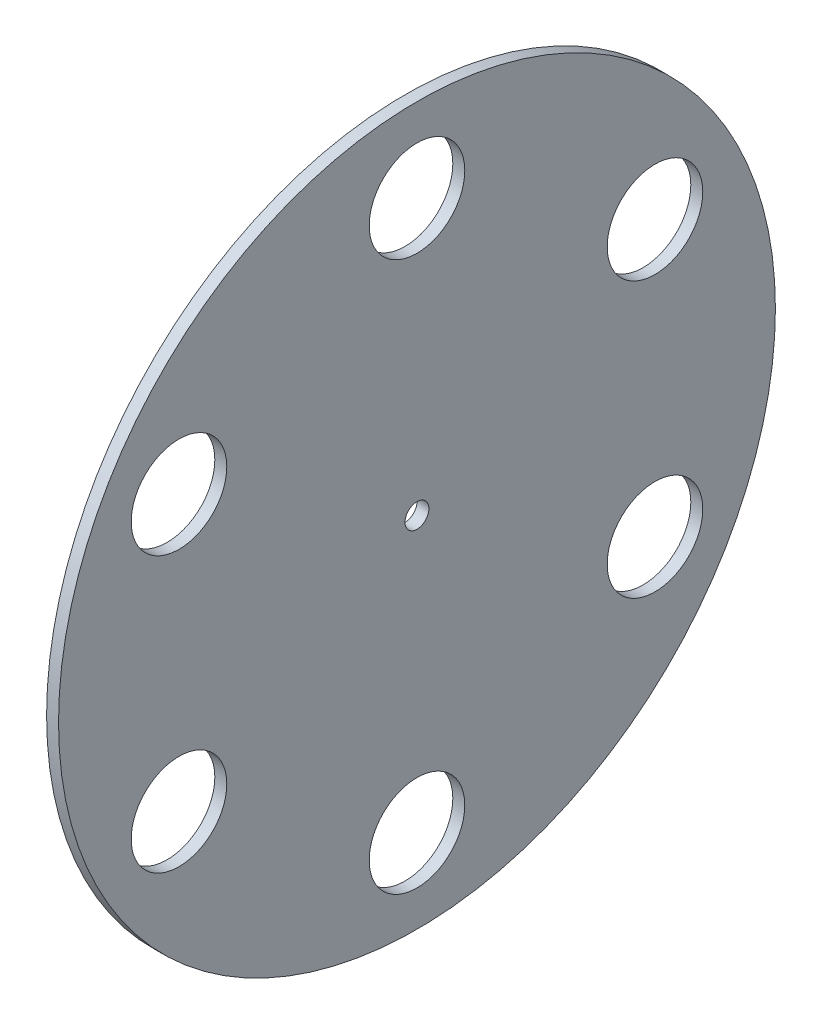
ISO-10303-21;
HEADER;
FILE_DESCRIPTION(('STEP AP214'),'2;1');
FILE_NAME('part.step','',(''),(''),'','','');
FILE_SCHEMA(('AUTOMOTIVE_DESIGN { 1 0 10303 214 1 1 1 1 }'));
ENDSEC;
DATA;
#1=APPLICATION_CONTEXT('core data for automotive mechanical design processes');
#2=APPLICATION_PROTOCOL_DEFINITION('international standard','automotive_design',2000,#1);
#3=PRODUCT_CONTEXT('',#1,'mechanical');
#4=PRODUCT('Part','Part','',(#3));
#5=PRODUCT_RELATED_PRODUCT_CATEGORY('part','',(#4));
#6=PRODUCT_DEFINITION_FORMATION('','',#4);
#7=PRODUCT_DEFINITION_CONTEXT('part definition',#1,'design');
#8=PRODUCT_DEFINITION('design','',#6,#7);
#9=PRODUCT_DEFINITION_SHAPE('','',#8);
#10=(LENGTH_UNIT() NAMED_UNIT(*) SI_UNIT(.MILLI.,.METRE.));
#11=(NAMED_UNIT(*) PLANE_ANGLE_UNIT() SI_UNIT($,.RADIAN.));
#12=(NAMED_UNIT(*) SI_UNIT($,.STERADIAN.) SOLID_ANGLE_UNIT());
#13=UNCERTAINTY_MEASURE_WITH_UNIT(LENGTH_MEASURE(1.E-05),#10,'distance_accuracy_value','');
#14=(GEOMETRIC_REPRESENTATION_CONTEXT(3) GLOBAL_UNCERTAINTY_ASSIGNED_CONTEXT((#13)) GLOBAL_UNIT_ASSIGNED_CONTEXT((#10,
#11,#12)) REPRESENTATION_CONTEXT('',''));
#15=CARTESIAN_POINT('',(0.,0.,0.));
#16=DIRECTION('',(0.,0.,1.));
#17=DIRECTION('',(1.,0.,0.));
#18=AXIS2_PLACEMENT_3D('',#15,#16,#17);
#19=CARTESIAN_POINT('',(10.,0.,0.));
#20=DIRECTION('',(1.,0.,0.));
#21=DIRECTION('',(0.,0.,-1.));
#22=AXIS2_PLACEMENT_3D('',#19,#20,#21);
#23=PLANE('',#22);
#24=CARTESIAN_POINT('',(10.,-115.000000000009,199.185842870406));
#25=DIRECTION('',(1.,0.,0.));
#26=DIRECTION('',(0.,0.,-1.));
#27=AXIS2_PLACEMENT_3D('',#24,#25,#26);
#28=CIRCLE('',#27,40.);
#29=CARTESIAN_POINT('',(10.,-115.000000000009,159.185842870406));
#30=VERTEX_POINT('',#29);
#31=EDGE_CURVE('E70',#30,#30,#28,.T.);
#32=ORIENTED_EDGE('',*,*,#31,.F.);
#33=EDGE_LOOP('',(#32));
#34=FACE_BOUND('',#33,.T.);
#35=CARTESIAN_POINT('',(10.,-114.999999999991,-199.185842870436));
#36=DIRECTION('',(1.,0.,0.));
#37=DIRECTION('',(0.,0.,-1.));
#38=AXIS2_PLACEMENT_3D('',#35,#36,#37);
#39=CIRCLE('',#38,40.);
#40=CARTESIAN_POINT('',(10.,-114.999999999991,-239.185842870436));
#41=VERTEX_POINT('',#40);
#42=EDGE_CURVE('E58',#41,#41,#39,.T.);
#43=ORIENTED_EDGE('',*,*,#42,.F.);
#44=EDGE_LOOP('',(#43));
#45=FACE_BOUND('',#44,.T.);
#46=CARTESIAN_POINT('',(10.,230.,0.));
#47=DIRECTION('',(1.,0.,0.));
#48=DIRECTION('',(0.,0.,-1.));
#49=AXIS2_PLACEMENT_3D('',#46,#47,#48);
#50=CIRCLE('',#49,40.);
#51=CARTESIAN_POINT('',(10.,230.,-40.));
#52=VERTEX_POINT('',#51);
#53=EDGE_CURVE('E46',#52,#52,#50,.T.);
#54=ORIENTED_EDGE('',*,*,#53,.F.);
#55=EDGE_LOOP('',(#54));
#56=FACE_BOUND('',#55,.T.);
#57=CARTESIAN_POINT('',(10.,0.,0.));
#58=DIRECTION('',(1.,0.,0.));
#59=DIRECTION('',(0.,0.,-1.));
#60=AXIS2_PLACEMENT_3D('',#57,#58,#59);
#61=CIRCLE('',#60,300.);
#62=CARTESIAN_POINT('',(10.,0.,-300.));
#63=VERTEX_POINT('',#62);
#64=EDGE_CURVE('E10',#63,#63,#61,.T.);
#65=ORIENTED_EDGE('',*,*,#64,.T.);
#66=EDGE_LOOP('',(#65));
#67=FACE_BOUND('',#66,.T.);
#68=CARTESIAN_POINT('',(10.,0.,0.));
#69=DIRECTION('',(1.,0.,0.));
#70=DIRECTION('',(0.,0.,-1.));
#71=AXIS2_PLACEMENT_3D('',#68,#69,#70);
#72=CIRCLE('',#71,10.);
#73=CARTESIAN_POINT('',(10.,0.,-10.));
#74=VERTEX_POINT('',#73);
#75=EDGE_CURVE('E41',#74,#74,#72,.T.);
#76=ORIENTED_EDGE('',*,*,#75,.F.);
#77=EDGE_LOOP('',(#76));
#78=FACE_BOUND('',#77,.T.);
#79=CARTESIAN_POINT('',(10.,115.000000000009,-199.185842870426));
#80=DIRECTION('',(1.,0.,0.));
#81=DIRECTION('',(0.,0.,-1.));
#82=AXIS2_PLACEMENT_3D('',#79,#80,#81);
#83=CIRCLE('',#82,40.);
#84=CARTESIAN_POINT('',(10.,115.000000000009,-239.185842870426));
#85=VERTEX_POINT('',#84);
#86=EDGE_CURVE('E52',#85,#85,#83,.T.);
#87=ORIENTED_EDGE('',*,*,#86,.F.);
#88=EDGE_LOOP('',(#87));
#89=FACE_BOUND('',#88,.T.);
#90=CARTESIAN_POINT('',(10.,-230.,-2.04256667391173E-11));
#91=DIRECTION('',(1.,0.,0.));
#92=DIRECTION('',(0.,0.,-1.));
#93=AXIS2_PLACEMENT_3D('',#90,#91,#92);
#94=CIRCLE('',#93,40.);
#95=CARTESIAN_POINT('',(10.,-230.,-40.0000000000204));
#96=VERTEX_POINT('',#95);
#97=EDGE_CURVE('E64',#96,#96,#94,.T.);
#98=ORIENTED_EDGE('',*,*,#97,.F.);
#99=EDGE_LOOP('',(#98));
#100=FACE_BOUND('',#99,.T.);
#101=CARTESIAN_POINT('',(10.,114.999999999991,199.185842870416));
#102=DIRECTION('',(1.,0.,0.));
#103=DIRECTION('',(0.,0.,-1.));
#104=AXIS2_PLACEMENT_3D('',#101,#102,#103);
#105=CIRCLE('',#104,40.);
#106=CARTESIAN_POINT('',(10.,114.999999999991,159.185842870416));
#107=VERTEX_POINT('',#106);
#108=EDGE_CURVE('E76',#107,#107,#105,.T.);
#109=ORIENTED_EDGE('',*,*,#108,.F.);
#110=EDGE_LOOP('',(#109));
#111=FACE_BOUND('',#110,.T.);
#112=ADVANCED_FACE('F30',(#34,#45,#56,#67,#78,#89,#100,#111),#23,.T.);
#113=CARTESIAN_POINT('',(0.,0.,0.));
#114=DIRECTION('',(1.,0.,0.));
#115=DIRECTION('',(0.,0.,-1.));
#116=AXIS2_PLACEMENT_3D('',#113,#114,#115);
#117=PLANE('',#116);
#118=CARTESIAN_POINT('',(0.,0.,0.));
#119=DIRECTION('',(1.,0.,0.));
#120=DIRECTION('',(0.,0.,-1.));
#121=AXIS2_PLACEMENT_3D('',#118,#119,#120);
#122=CIRCLE('',#121,300.);
#123=CARTESIAN_POINT('',(0.,0.,-300.));
#124=VERTEX_POINT('',#123);
#125=EDGE_CURVE('E34',#124,#124,#122,.T.);
#126=ORIENTED_EDGE('',*,*,#125,.F.);
#127=EDGE_LOOP('',(#126));
#128=FACE_BOUND('',#127,.T.);
#129=CARTESIAN_POINT('',(0.,0.,0.));
#130=DIRECTION('',(1.,0.,0.));
#131=DIRECTION('',(0.,0.,-1.));
#132=AXIS2_PLACEMENT_3D('',#129,#130,#131);
#133=CIRCLE('',#132,10.);
#134=CARTESIAN_POINT('',(0.,0.,-10.));
#135=VERTEX_POINT('',#134);
#136=EDGE_CURVE('E43',#135,#135,#133,.T.);
#137=ORIENTED_EDGE('',*,*,#136,.T.);
#138=EDGE_LOOP('',(#137));
#139=FACE_BOUND('',#138,.T.);
#140=CARTESIAN_POINT('',(0.,230.,0.));
#141=DIRECTION('',(1.,0.,0.));
#142=DIRECTION('',(0.,0.,-1.));
#143=AXIS2_PLACEMENT_3D('',#140,#141,#142);
#144=CIRCLE('',#143,40.);
#145=CARTESIAN_POINT('',(0.,230.,-40.));
#146=VERTEX_POINT('',#145);
#147=EDGE_CURVE('E49',#146,#146,#144,.T.);
#148=ORIENTED_EDGE('',*,*,#147,.T.);
#149=EDGE_LOOP('',(#148));
#150=FACE_BOUND('',#149,.T.);
#151=CARTESIAN_POINT('',(0.,115.000000000009,-199.185842870426));
#152=DIRECTION('',(1.,0.,0.));
#153=DIRECTION('',(0.,0.,-1.));
#154=AXIS2_PLACEMENT_3D('',#151,#152,#153);
#155=CIRCLE('',#154,40.);
#156=CARTESIAN_POINT('',(0.,115.000000000009,-239.185842870426));
#157=VERTEX_POINT('',#156);
#158=EDGE_CURVE('E55',#157,#157,#155,.T.);
#159=ORIENTED_EDGE('',*,*,#158,.T.);
#160=EDGE_LOOP('',(#159));
#161=FACE_BOUND('',#160,.T.);
#162=CARTESIAN_POINT('',(0.,-114.999999999991,-199.185842870436));
#163=DIRECTION('',(1.,0.,0.));
#164=DIRECTION('',(0.,0.,-1.));
#165=AXIS2_PLACEMENT_3D('',#162,#163,#164);
#166=CIRCLE('',#165,40.);
#167=CARTESIAN_POINT('',(0.,-114.999999999991,-239.185842870436));
#168=VERTEX_POINT('',#167);
#169=EDGE_CURVE('E61',#168,#168,#166,.T.);
#170=ORIENTED_EDGE('',*,*,#169,.T.);
#171=EDGE_LOOP('',(#170));
#172=FACE_BOUND('',#171,.T.);
#173=CARTESIAN_POINT('',(0.,-230.,-2.04256667391173E-11));
#174=DIRECTION('',(1.,0.,0.));
#175=DIRECTION('',(0.,0.,-1.));
#176=AXIS2_PLACEMENT_3D('',#173,#174,#175);
#177=CIRCLE('',#176,40.);
#178=CARTESIAN_POINT('',(0.,-230.,-40.0000000000204));
#179=VERTEX_POINT('',#178);
#180=EDGE_CURVE('E67',#179,#179,#177,.T.);
#181=ORIENTED_EDGE('',*,*,#180,.T.);
#182=EDGE_LOOP('',(#181));
#183=FACE_BOUND('',#182,.T.);
#184=CARTESIAN_POINT('',(0.,-115.000000000009,199.185842870406));
#185=DIRECTION('',(1.,0.,0.));
#186=DIRECTION('',(0.,0.,-1.));
#187=AXIS2_PLACEMENT_3D('',#184,#185,#186);
#188=CIRCLE('',#187,40.);
#189=CARTESIAN_POINT('',(0.,-115.000000000009,159.185842870406));
#190=VERTEX_POINT('',#189);
#191=EDGE_CURVE('E73',#190,#190,#188,.T.);
#192=ORIENTED_EDGE('',*,*,#191,.T.);
#193=EDGE_LOOP('',(#192));
#194=FACE_BOUND('',#193,.T.);
#195=CARTESIAN_POINT('',(0.,114.999999999991,199.185842870416));
#196=DIRECTION('',(1.,0.,0.));
#197=DIRECTION('',(0.,0.,-1.));
#198=AXIS2_PLACEMENT_3D('',#195,#196,#197);
#199=CIRCLE('',#198,40.);
#200=CARTESIAN_POINT('',(0.,114.999999999991,159.185842870416));
#201=VERTEX_POINT('',#200);
#202=EDGE_CURVE('E79',#201,#201,#199,.T.);
#203=ORIENTED_EDGE('',*,*,#202,.T.);
#204=EDGE_LOOP('',(#203));
#205=FACE_BOUND('',#204,.T.);
#206=ADVANCED_FACE('F89',(#128,#139,#150,#161,#172,#183,#194,#205),#117,.F.);
#207=CARTESIAN_POINT('',(10.,0.,0.));
#208=DIRECTION('',(-1.,0.,0.));
#209=DIRECTION('',(0.,0.,1.));
#210=AXIS2_PLACEMENT_3D('',#207,#208,#209);
#211=CYLINDRICAL_SURFACE('',#210,300.);
#212=ORIENTED_EDGE('',*,*,#64,.F.);
#213=EDGE_LOOP('',(#212));
#214=FACE_BOUND('',#213,.T.);
#215=ORIENTED_EDGE('',*,*,#125,.T.);
#216=EDGE_LOOP('',(#215));
#217=FACE_BOUND('',#216,.T.);
#218=ADVANCED_FACE('F32',(#214,#217),#211,.T.);
#219=CARTESIAN_POINT('',(10.,0.,0.));
#220=DIRECTION('',(-1.,0.,0.));
#221=DIRECTION('',(0.,0.,1.));
#222=AXIS2_PLACEMENT_3D('',#219,#220,#221);
#223=CYLINDRICAL_SURFACE('',#222,10.);
#224=ORIENTED_EDGE('',*,*,#75,.T.);
#225=EDGE_LOOP('',(#224));
#226=FACE_BOUND('',#225,.T.);
#227=ORIENTED_EDGE('',*,*,#136,.F.);
#228=EDGE_LOOP('',(#227));
#229=FACE_BOUND('',#228,.T.);
#230=ADVANCED_FACE('F99',(#226,#229),#223,.F.);
#231=CARTESIAN_POINT('',(10.,230.,0.));
#232=DIRECTION('',(-1.,0.,0.));
#233=DIRECTION('',(0.,0.,1.));
#234=AXIS2_PLACEMENT_3D('',#231,#232,#233);
#235=CYLINDRICAL_SURFACE('',#234,40.);
#236=ORIENTED_EDGE('',*,*,#53,.T.);
#237=EDGE_LOOP('',(#236));
#238=FACE_BOUND('',#237,.T.);
#239=ORIENTED_EDGE('',*,*,#147,.F.);
#240=EDGE_LOOP('',(#239));
#241=FACE_BOUND('',#240,.T.);
#242=ADVANCED_FACE('F102',(#238,#241),#235,.F.);
#243=CARTESIAN_POINT('',(10.,115.000000000009,-199.185842870426));
#244=DIRECTION('',(-1.,0.,0.));
#245=DIRECTION('',(0.,0.,1.));
#246=AXIS2_PLACEMENT_3D('',#243,#244,#245);
#247=CYLINDRICAL_SURFACE('',#246,40.);
#248=ORIENTED_EDGE('',*,*,#86,.T.);
#249=EDGE_LOOP('',(#248));
#250=FACE_BOUND('',#249,.T.);
#251=ORIENTED_EDGE('',*,*,#158,.F.);
#252=EDGE_LOOP('',(#251));
#253=FACE_BOUND('',#252,.T.);
#254=ADVANCED_FACE('F106',(#250,#253),#247,.F.);
#255=CARTESIAN_POINT('',(10.,-114.999999999991,-199.185842870436));
#256=DIRECTION('',(-1.,0.,0.));
#257=DIRECTION('',(0.,0.,1.));
#258=AXIS2_PLACEMENT_3D('',#255,#256,#257);
#259=CYLINDRICAL_SURFACE('',#258,40.);
#260=ORIENTED_EDGE('',*,*,#42,.T.);
#261=EDGE_LOOP('',(#260));
#262=FACE_BOUND('',#261,.T.);
#263=ORIENTED_EDGE('',*,*,#169,.F.);
#264=EDGE_LOOP('',(#263));
#265=FACE_BOUND('',#264,.T.);
#266=ADVANCED_FACE('F110',(#262,#265),#259,.F.);
#267=CARTESIAN_POINT('',(10.,-230.,-2.04256667391173E-11));
#268=DIRECTION('',(-1.,0.,0.));
#269=DIRECTION('',(0.,0.,1.));
#270=AXIS2_PLACEMENT_3D('',#267,#268,#269);
#271=CYLINDRICAL_SURFACE('',#270,40.);
#272=ORIENTED_EDGE('',*,*,#97,.T.);
#273=EDGE_LOOP('',(#272));
#274=FACE_BOUND('',#273,.T.);
#275=ORIENTED_EDGE('',*,*,#180,.F.);
#276=EDGE_LOOP('',(#275));
#277=FACE_BOUND('',#276,.T.);
#278=ADVANCED_FACE('F114',(#274,#277),#271,.F.);
#279=CARTESIAN_POINT('',(10.,-115.000000000009,199.185842870406));
#280=DIRECTION('',(-1.,0.,0.));
#281=DIRECTION('',(0.,0.,1.));
#282=AXIS2_PLACEMENT_3D('',#279,#280,#281);
#283=CYLINDRICAL_SURFACE('',#282,40.);
#284=ORIENTED_EDGE('',*,*,#31,.T.);
#285=EDGE_LOOP('',(#284));
#286=FACE_BOUND('',#285,.T.);
#287=ORIENTED_EDGE('',*,*,#191,.F.);
#288=EDGE_LOOP('',(#287));
#289=FACE_BOUND('',#288,.T.);
#290=ADVANCED_FACE('F118',(#286,#289),#283,.F.);
#291=CARTESIAN_POINT('',(10.,114.999999999991,199.185842870416));
#292=DIRECTION('',(-1.,0.,0.));
#293=DIRECTION('',(0.,0.,1.));
#294=AXIS2_PLACEMENT_3D('',#291,#292,#293);
#295=CYLINDRICAL_SURFACE('',#294,40.);
#296=ORIENTED_EDGE('',*,*,#108,.T.);
#297=EDGE_LOOP('',(#296));
#298=FACE_BOUND('',#297,.T.);
#299=ORIENTED_EDGE('',*,*,#202,.F.);
#300=EDGE_LOOP('',(#299));
#301=FACE_BOUND('',#300,.T.);
#302=ADVANCED_FACE('F85',(#298,#301),#295,.F.);
#303=CLOSED_SHELL('',(#112,#206,#218,#230,#242,#254,#266,#278,#290,#302));
#304=MANIFOLD_SOLID_BREP('B2',#303);
#305=ADVANCED_BREP_SHAPE_REPRESENTATION('',(#18,#304),#14);
#306=SHAPE_DEFINITION_REPRESENTATION(#9,#305);
ENDSEC;
END-ISO-10303-21;
